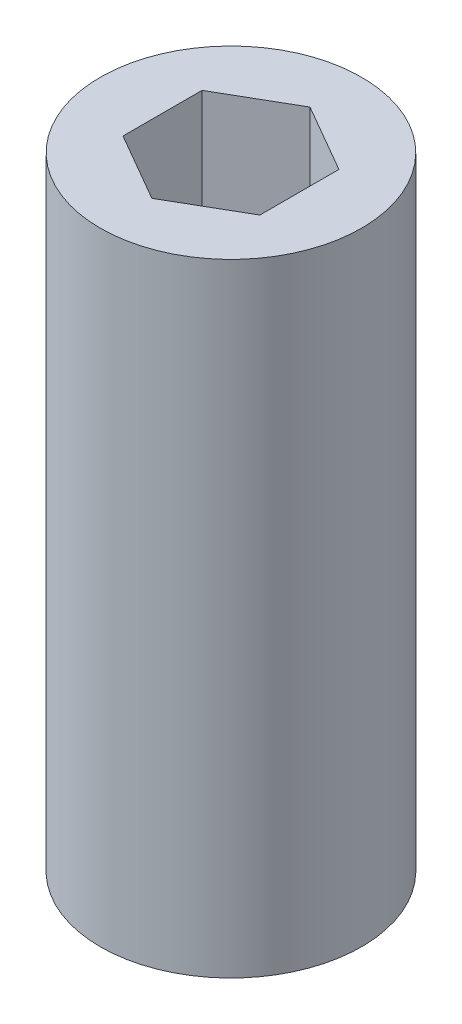
ISO-10303-21;
HEADER;
FILE_DESCRIPTION(('STEP AP214'),'2;1');
FILE_NAME('part.step','',(''),(''),'','','');
FILE_SCHEMA(('AUTOMOTIVE_DESIGN { 1 0 10303 214 1 1 1 1 }'));
ENDSEC;
DATA;
#1=APPLICATION_CONTEXT('core data for automotive mechanical design processes');
#2=APPLICATION_PROTOCOL_DEFINITION('international standard','automotive_design',2000,#1);
#3=PRODUCT_CONTEXT('',#1,'mechanical');
#4=PRODUCT('Part','Part','',(#3));
#5=PRODUCT_RELATED_PRODUCT_CATEGORY('part','',(#4));
#6=PRODUCT_DEFINITION_FORMATION('','',#4);
#7=PRODUCT_DEFINITION_CONTEXT('part definition',#1,'design');
#8=PRODUCT_DEFINITION('design','',#6,#7);
#9=PRODUCT_DEFINITION_SHAPE('','',#8);
#10=(LENGTH_UNIT() NAMED_UNIT(*) SI_UNIT(.MILLI.,.METRE.));
#11=(NAMED_UNIT(*) PLANE_ANGLE_UNIT() SI_UNIT($,.RADIAN.));
#12=(NAMED_UNIT(*) SI_UNIT($,.STERADIAN.) SOLID_ANGLE_UNIT());
#13=UNCERTAINTY_MEASURE_WITH_UNIT(LENGTH_MEASURE(1.E-05),#10,'distance_accuracy_value','');
#14=(GEOMETRIC_REPRESENTATION_CONTEXT(3) GLOBAL_UNCERTAINTY_ASSIGNED_CONTEXT((#13)) GLOBAL_UNIT_ASSIGNED_CONTEXT((#10,
#11,#12)) REPRESENTATION_CONTEXT('',''));
#15=CARTESIAN_POINT('',(0.,0.,0.));
#16=DIRECTION('',(0.,0.,1.));
#17=DIRECTION('',(1.,0.,0.));
#18=AXIS2_PLACEMENT_3D('',#15,#16,#17);
#19=CARTESIAN_POINT('',(0.,10.,0.));
#20=DIRECTION('',(0.,1.,0.));
#21=DIRECTION('',(0.,0.,1.));
#22=AXIS2_PLACEMENT_3D('',#19,#20,#21);
#23=PLANE('',#22);
#24=CARTESIAN_POINT('',(0.,10.,0.));
#25=DIRECTION('',(0.,1.,0.));
#26=DIRECTION('',(0.,0.,1.));
#27=AXIS2_PLACEMENT_3D('',#24,#25,#26);
#28=CIRCLE('',#27,2.1);
#29=CARTESIAN_POINT('',(0.,10.,2.1));
#30=VERTEX_POINT('',#29);
#31=EDGE_CURVE('E11',#30,#30,#28,.T.);
#32=ORIENTED_EDGE('',*,*,#31,.T.);
#33=EDGE_LOOP('',(#32));
#34=FACE_BOUND('',#33,.T.);
#35=DIRECTION('',(0.,0.,-1.));
#36=VECTOR('',#35,1.);
#37=CARTESIAN_POINT('',(1.1,10.,0.635085296108588));
#38=LINE('',#37,#36);
#39=CARTESIAN_POINT('',(1.1,10.,0.635085296108588));
#40=VERTEX_POINT('',#39);
#41=CARTESIAN_POINT('',(1.1,10.,-0.635085296108589));
#42=VERTEX_POINT('',#41);
#43=EDGE_CURVE('E102',#40,#42,#38,.T.);
#44=ORIENTED_EDGE('',*,*,#43,.F.);
#45=DIRECTION('',(0.866025403784439,0.,-0.5));
#46=VECTOR('',#45,1.);
#47=CARTESIAN_POINT('',(0.,10.,1.27017059221718));
#48=LINE('',#47,#46);
#49=CARTESIAN_POINT('',(0.,10.,1.27017059221718));
#50=VERTEX_POINT('',#49);
#51=EDGE_CURVE('E93',#50,#40,#48,.T.);
#52=ORIENTED_EDGE('',*,*,#51,.F.);
#53=DIRECTION('',(0.866025403784439,0.,0.5));
#54=VECTOR('',#53,1.);
#55=CARTESIAN_POINT('',(-1.1,10.,0.635085296108588));
#56=LINE('',#55,#54);
#57=CARTESIAN_POINT('',(-1.1,10.,0.635085296108589));
#58=VERTEX_POINT('',#57);
#59=EDGE_CURVE('E127',#58,#50,#56,.T.);
#60=ORIENTED_EDGE('',*,*,#59,.F.);
#61=DIRECTION('',(0.,0.,1.));
#62=VECTOR('',#61,1.);
#63=CARTESIAN_POINT('',(-1.1,10.,-0.635085296108589));
#64=LINE('',#63,#62);
#65=CARTESIAN_POINT('',(-1.1,10.,-0.635085296108589));
#66=VERTEX_POINT('',#65);
#67=EDGE_CURVE('E124',#66,#58,#64,.T.);
#68=ORIENTED_EDGE('',*,*,#67,.F.);
#69=DIRECTION('',(-0.866025403784438,0.,0.5));
#70=VECTOR('',#69,1.);
#71=CARTESIAN_POINT('',(0.,10.,-1.27017059221718));
#72=LINE('',#71,#70);
#73=CARTESIAN_POINT('',(0.,10.,-1.27017059221718));
#74=VERTEX_POINT('',#73);
#75=EDGE_CURVE('E119',#74,#66,#72,.T.);
#76=ORIENTED_EDGE('',*,*,#75,.F.);
#77=DIRECTION('',(-0.866025403784439,0.,-0.5));
#78=VECTOR('',#77,1.);
#79=CARTESIAN_POINT('',(1.1,10.,-0.635085296108589));
#80=LINE('',#79,#78);
#81=EDGE_CURVE('E115',#42,#74,#80,.T.);
#82=ORIENTED_EDGE('',*,*,#81,.F.);
#83=EDGE_LOOP('',(#44,#52,#60,#68,#76,#82));
#84=FACE_BOUND('',#83,.T.);
#85=ADVANCED_FACE('F39',(#34,#84),#23,.T.);
#86=CARTESIAN_POINT('',(0.,0.,0.));
#87=DIRECTION('',(0.,1.,0.));
#88=DIRECTION('',(0.,0.,1.));
#89=AXIS2_PLACEMENT_3D('',#86,#87,#88);
#90=PLANE('',#89);
#91=CARTESIAN_POINT('',(0.,0.,0.));
#92=DIRECTION('',(0.,1.,0.));
#93=DIRECTION('',(0.,0.,1.));
#94=AXIS2_PLACEMENT_3D('',#91,#92,#93);
#95=CIRCLE('',#94,2.1);
#96=CARTESIAN_POINT('',(0.,0.,2.1));
#97=VERTEX_POINT('',#96);
#98=EDGE_CURVE('E43',#97,#97,#95,.T.);
#99=ORIENTED_EDGE('',*,*,#98,.F.);
#100=EDGE_LOOP('',(#99));
#101=FACE_BOUND('',#100,.T.);
#102=DIRECTION('',(0.866025403784439,0.,-0.5));
#103=VECTOR('',#102,1.);
#104=CARTESIAN_POINT('',(0.,0.,1.27017059221718));
#105=LINE('',#104,#103);
#106=CARTESIAN_POINT('',(0.,0.,1.27017059221718));
#107=VERTEX_POINT('',#106);
#108=CARTESIAN_POINT('',(1.1,0.,0.635085296108588));
#109=VERTEX_POINT('',#108);
#110=EDGE_CURVE('E63',#107,#109,#105,.T.);
#111=ORIENTED_EDGE('',*,*,#110,.T.);
#112=DIRECTION('',(0.,0.,-1.));
#113=VECTOR('',#112,1.);
#114=CARTESIAN_POINT('',(1.1,0.,0.635085296108588));
#115=LINE('',#114,#113);
#116=CARTESIAN_POINT('',(1.1,0.,-0.635085296108589));
#117=VERTEX_POINT('',#116);
#118=EDGE_CURVE('E109',#109,#117,#115,.T.);
#119=ORIENTED_EDGE('',*,*,#118,.T.);
#120=DIRECTION('',(-0.866025403784439,0.,-0.5));
#121=VECTOR('',#120,1.);
#122=CARTESIAN_POINT('',(1.1,0.,-0.635085296108589));
#123=LINE('',#122,#121);
#124=CARTESIAN_POINT('',(0.,0.,-1.27017059221718));
#125=VERTEX_POINT('',#124);
#126=EDGE_CURVE('E134',#117,#125,#123,.T.);
#127=ORIENTED_EDGE('',*,*,#126,.T.);
#128=DIRECTION('',(-0.866025403784438,0.,0.5));
#129=VECTOR('',#128,1.);
#130=CARTESIAN_POINT('',(0.,0.,-1.27017059221718));
#131=LINE('',#130,#129);
#132=CARTESIAN_POINT('',(-1.1,0.,-0.635085296108589));
#133=VERTEX_POINT('',#132);
#134=EDGE_CURVE('E138',#125,#133,#131,.T.);
#135=ORIENTED_EDGE('',*,*,#134,.T.);
#136=DIRECTION('',(0.,0.,1.));
#137=VECTOR('',#136,1.);
#138=CARTESIAN_POINT('',(-1.1,0.,-0.635085296108589));
#139=LINE('',#138,#137);
#140=CARTESIAN_POINT('',(-1.1,0.,0.635085296108588));
#141=VERTEX_POINT('',#140);
#142=EDGE_CURVE('E142',#133,#141,#139,.T.);
#143=ORIENTED_EDGE('',*,*,#142,.T.);
#144=DIRECTION('',(0.866025403784439,0.,0.5));
#145=VECTOR('',#144,1.);
#146=CARTESIAN_POINT('',(-1.1,0.,0.635085296108588));
#147=LINE('',#146,#145);
#148=EDGE_CURVE('E103',#141,#107,#147,.T.);
#149=ORIENTED_EDGE('',*,*,#148,.T.);
#150=EDGE_LOOP('',(#111,#119,#127,#135,#143,#149));
#151=FACE_BOUND('',#150,.T.);
#152=ADVANCED_FACE('F166',(#101,#151),#90,.F.);
#153=CARTESIAN_POINT('',(0.,10.,0.));
#154=DIRECTION('',(0.,-1.,0.));
#155=DIRECTION('',(0.,0.,-1.));
#156=AXIS2_PLACEMENT_3D('',#153,#154,#155);
#157=CYLINDRICAL_SURFACE('',#156,2.1);
#158=ORIENTED_EDGE('',*,*,#31,.F.);
#159=EDGE_LOOP('',(#158));
#160=FACE_BOUND('',#159,.T.);
#161=ORIENTED_EDGE('',*,*,#98,.T.);
#162=EDGE_LOOP('',(#161));
#163=FACE_BOUND('',#162,.T.);
#164=ADVANCED_FACE('F41',(#160,#163),#157,.T.);
#165=CARTESIAN_POINT('',(0.,10.,1.27017059221718));
#166=DIRECTION('',(-0.5,0.,-0.866025403784439));
#167=DIRECTION('',(-0.866025403784439,0.,0.5));
#168=AXIS2_PLACEMENT_3D('',#165,#166,#167);
#169=PLANE('',#168);
#170=ORIENTED_EDGE('',*,*,#110,.F.);
#171=DIRECTION('',(0.,-1.,0.));
#172=VECTOR('',#171,1.);
#173=CARTESIAN_POINT('',(0.,10.,1.27017059221718));
#174=LINE('',#173,#172);
#175=EDGE_CURVE('E97',#50,#107,#174,.T.);
#176=ORIENTED_EDGE('',*,*,#175,.F.);
#177=ORIENTED_EDGE('',*,*,#51,.T.);
#178=DIRECTION('',(0.,-1.,0.));
#179=VECTOR('',#178,1.);
#180=CARTESIAN_POINT('',(1.1,10.,0.635085296108588));
#181=LINE('',#180,#179);
#182=EDGE_CURVE('E96',#40,#109,#181,.T.);
#183=ORIENTED_EDGE('',*,*,#182,.T.);
#184=EDGE_LOOP('',(#170,#176,#177,#183));
#185=FACE_BOUND('',#184,.T.);
#186=ADVANCED_FACE('F95',(#185),#169,.T.);
#187=CARTESIAN_POINT('',(1.1,10.,0.635085296108588));
#188=DIRECTION('',(-1.,0.,0.));
#189=DIRECTION('',(0.,0.,1.));
#190=AXIS2_PLACEMENT_3D('',#187,#188,#189);
#191=PLANE('',#190);
#192=ORIENTED_EDGE('',*,*,#118,.F.);
#193=ORIENTED_EDGE('',*,*,#182,.F.);
#194=ORIENTED_EDGE('',*,*,#43,.T.);
#195=DIRECTION('',(0.,-1.,0.));
#196=VECTOR('',#195,1.);
#197=CARTESIAN_POINT('',(1.1,10.,-0.635085296108589));
#198=LINE('',#197,#196);
#199=EDGE_CURVE('E111',#42,#117,#198,.T.);
#200=ORIENTED_EDGE('',*,*,#199,.T.);
#201=EDGE_LOOP('',(#192,#193,#194,#200));
#202=FACE_BOUND('',#201,.T.);
#203=ADVANCED_FACE('F106',(#202),#191,.T.);
#204=CARTESIAN_POINT('',(1.1,10.,-0.635085296108589));
#205=DIRECTION('',(-0.5,0.,0.866025403784439));
#206=DIRECTION('',(0.866025403784439,0.,0.5));
#207=AXIS2_PLACEMENT_3D('',#204,#205,#206);
#208=PLANE('',#207);
#209=ORIENTED_EDGE('',*,*,#126,.F.);
#210=ORIENTED_EDGE('',*,*,#199,.F.);
#211=ORIENTED_EDGE('',*,*,#81,.T.);
#212=DIRECTION('',(0.,-1.,0.));
#213=VECTOR('',#212,1.);
#214=CARTESIAN_POINT('',(0.,10.,-1.27017059221718));
#215=LINE('',#214,#213);
#216=EDGE_CURVE('E156',#74,#125,#215,.T.);
#217=ORIENTED_EDGE('',*,*,#216,.T.);
#218=EDGE_LOOP('',(#209,#210,#211,#217));
#219=FACE_BOUND('',#218,.T.);
#220=ADVANCED_FACE('F162',(#219),#208,.T.);
#221=CARTESIAN_POINT('',(0.,10.,-1.27017059221718));
#222=DIRECTION('',(0.5,0.,0.866025403784439));
#223=DIRECTION('',(0.866025403784439,0.,-0.5));
#224=AXIS2_PLACEMENT_3D('',#221,#222,#223);
#225=PLANE('',#224);
#226=ORIENTED_EDGE('',*,*,#134,.F.);
#227=ORIENTED_EDGE('',*,*,#216,.F.);
#228=ORIENTED_EDGE('',*,*,#75,.T.);
#229=DIRECTION('',(0.,-1.,0.));
#230=VECTOR('',#229,1.);
#231=CARTESIAN_POINT('',(-1.1,10.,-0.635085296108589));
#232=LINE('',#231,#230);
#233=EDGE_CURVE('E153',#66,#133,#232,.T.);
#234=ORIENTED_EDGE('',*,*,#233,.T.);
#235=EDGE_LOOP('',(#226,#227,#228,#234));
#236=FACE_BOUND('',#235,.T.);
#237=ADVANCED_FACE('F174',(#236),#225,.T.);
#238=CARTESIAN_POINT('',(-1.1,10.,-0.635085296108589));
#239=DIRECTION('',(1.,0.,0.));
#240=DIRECTION('',(0.,0.,-1.));
#241=AXIS2_PLACEMENT_3D('',#238,#239,#240);
#242=PLANE('',#241);
#243=ORIENTED_EDGE('',*,*,#142,.F.);
#244=ORIENTED_EDGE('',*,*,#233,.F.);
#245=ORIENTED_EDGE('',*,*,#67,.T.);
#246=DIRECTION('',(0.,-1.,0.));
#247=VECTOR('',#246,1.);
#248=CARTESIAN_POINT('',(-1.1,10.,0.635085296108588));
#249=LINE('',#248,#247);
#250=EDGE_CURVE('E55',#58,#141,#249,.T.);
#251=ORIENTED_EDGE('',*,*,#250,.T.);
#252=EDGE_LOOP('',(#243,#244,#245,#251));
#253=FACE_BOUND('',#252,.T.);
#254=ADVANCED_FACE('F172',(#253),#242,.T.);
#255=CARTESIAN_POINT('',(-1.1,10.,0.635085296108588));
#256=DIRECTION('',(0.5,0.,-0.866025403784439));
#257=DIRECTION('',(-0.866025403784439,0.,-0.5));
#258=AXIS2_PLACEMENT_3D('',#255,#256,#257);
#259=PLANE('',#258);
#260=ORIENTED_EDGE('',*,*,#148,.F.);
#261=ORIENTED_EDGE('',*,*,#250,.F.);
#262=ORIENTED_EDGE('',*,*,#59,.T.);
#263=ORIENTED_EDGE('',*,*,#175,.T.);
#264=EDGE_LOOP('',(#260,#261,#262,#263));
#265=FACE_BOUND('',#264,.T.);
#266=ADVANCED_FACE('F168',(#265),#259,.T.);
#267=CLOSED_SHELL('',(#85,#152,#164,#186,#203,#220,#237,#254,#266));
#268=MANIFOLD_SOLID_BREP('B2',#267);
#269=ADVANCED_BREP_SHAPE_REPRESENTATION('',(#18,#268),#14);
#270=SHAPE_DEFINITION_REPRESENTATION(#9,#269);
ENDSEC;
END-ISO-10303-21;
